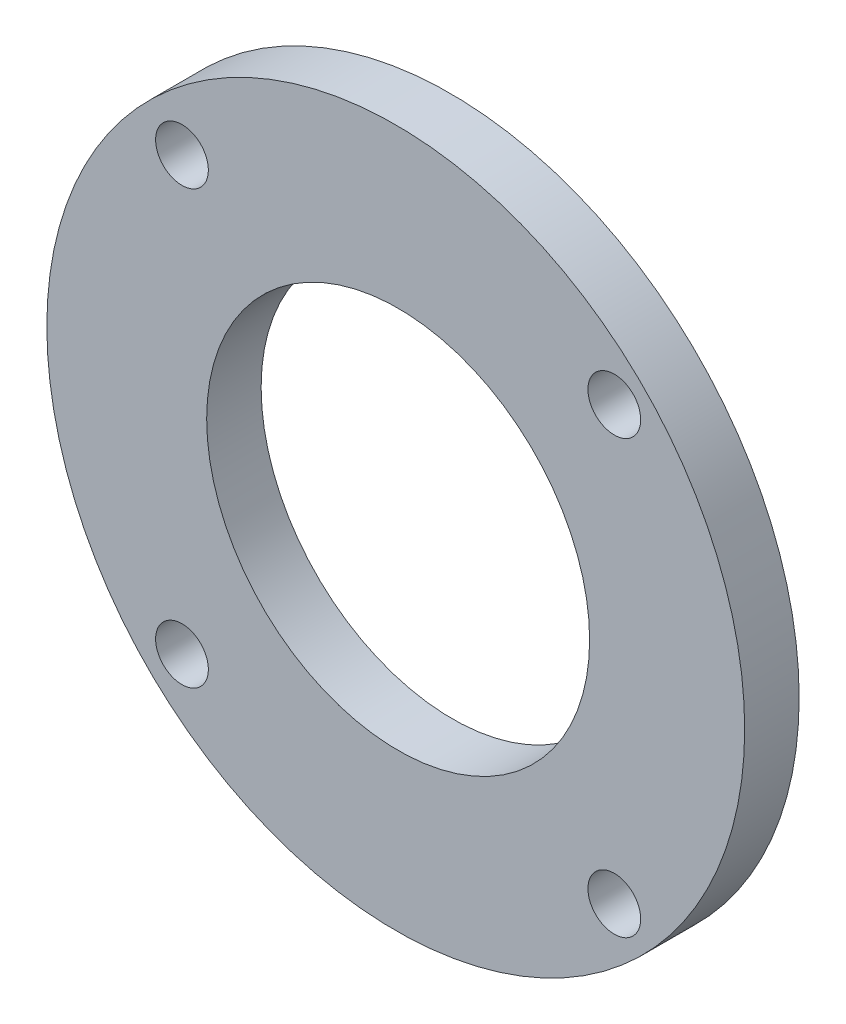
ISO-10303-21;
HEADER;
FILE_DESCRIPTION(('STEP AP214'),'2;1');
FILE_NAME('part.step','',(''),(''),'','','');
FILE_SCHEMA(('AUTOMOTIVE_DESIGN { 1 0 10303 214 1 1 1 1 }'));
ENDSEC;
DATA;
#1=APPLICATION_CONTEXT('core data for automotive mechanical design processes');
#2=APPLICATION_PROTOCOL_DEFINITION('international standard','automotive_design',2000,#1);
#3=PRODUCT_CONTEXT('',#1,'mechanical');
#4=PRODUCT('Part','Part','',(#3));
#5=PRODUCT_RELATED_PRODUCT_CATEGORY('part','',(#4));
#6=PRODUCT_DEFINITION_FORMATION('','',#4);
#7=PRODUCT_DEFINITION_CONTEXT('part definition',#1,'design');
#8=PRODUCT_DEFINITION('design','',#6,#7);
#9=PRODUCT_DEFINITION_SHAPE('','',#8);
#10=(LENGTH_UNIT() NAMED_UNIT(*) SI_UNIT(.MILLI.,.METRE.));
#11=(NAMED_UNIT(*) PLANE_ANGLE_UNIT() SI_UNIT($,.RADIAN.));
#12=(NAMED_UNIT(*) SI_UNIT($,.STERADIAN.) SOLID_ANGLE_UNIT());
#13=UNCERTAINTY_MEASURE_WITH_UNIT(LENGTH_MEASURE(1.E-05),#10,'distance_accuracy_value','');
#14=(GEOMETRIC_REPRESENTATION_CONTEXT(3) GLOBAL_UNCERTAINTY_ASSIGNED_CONTEXT((#13)) GLOBAL_UNIT_ASSIGNED_CONTEXT((#10,
#11,#12)) REPRESENTATION_CONTEXT('',''));
#15=CARTESIAN_POINT('',(0.,0.,0.));
#16=DIRECTION('',(0.,0.,1.));
#17=DIRECTION('',(1.,0.,0.));
#18=AXIS2_PLACEMENT_3D('',#15,#16,#17);
#19=CARTESIAN_POINT('',(22.0851636370484,22.238164350057,3.2));
#20=DIRECTION('',(0.,0.,-1.));
#21=DIRECTION('',(-1.,0.,0.));
#22=AXIS2_PLACEMENT_3D('',#19,#20,#21);
#23=CYLINDRICAL_SURFACE('',#22,20.5);
#24=CARTESIAN_POINT('',(22.0851636370484,22.238164350057,3.2));
#25=DIRECTION('',(0.,0.,1.));
#26=DIRECTION('',(1.,0.,0.));
#27=AXIS2_PLACEMENT_3D('',#24,#25,#26);
#28=CIRCLE('',#27,20.5);
#29=CARTESIAN_POINT('',(42.5851636370484,22.238164350057,3.2));
#30=VERTEX_POINT('',#29);
#31=EDGE_CURVE('E10',#30,#30,#28,.T.);
#32=ORIENTED_EDGE('',*,*,#31,.F.);
#33=EDGE_LOOP('',(#32));
#34=FACE_BOUND('',#33,.T.);
#35=CARTESIAN_POINT('',(22.0851636370484,22.238164350057,0.));
#36=DIRECTION('',(0.,0.,1.));
#37=DIRECTION('',(1.,0.,0.));
#38=AXIS2_PLACEMENT_3D('',#35,#36,#37);
#39=CIRCLE('',#38,20.5);
#40=CARTESIAN_POINT('',(42.5851636370484,22.238164350057,0.));
#41=VERTEX_POINT('',#40);
#42=EDGE_CURVE('E33',#41,#41,#39,.T.);
#43=ORIENTED_EDGE('',*,*,#42,.T.);
#44=EDGE_LOOP('',(#43));
#45=FACE_BOUND('',#44,.T.);
#46=ADVANCED_FACE('F27',(#34,#45),#23,.T.);
#47=CARTESIAN_POINT('',(22.0851636370484,22.238164350057,3.2));
#48=DIRECTION('',(0.,0.,1.));
#49=DIRECTION('',(1.,0.,0.));
#50=AXIS2_PLACEMENT_3D('',#47,#48,#49);
#51=PLANE('',#50);
#52=CARTESIAN_POINT('',(9.525,9.525,3.2));
#53=DIRECTION('',(0.,0.,1.));
#54=DIRECTION('',(1.,0.,0.));
#55=AXIS2_PLACEMENT_3D('',#52,#53,#54);
#56=CIRCLE('',#55,1.55);
#57=CARTESIAN_POINT('',(11.075,9.525,3.2));
#58=VERTEX_POINT('',#57);
#59=EDGE_CURVE('E67',#58,#58,#56,.T.);
#60=ORIENTED_EDGE('',*,*,#59,.F.);
#61=EDGE_LOOP('',(#60));
#62=FACE_BOUND('',#61,.T.);
#63=CARTESIAN_POINT('',(34.925,9.525,3.2));
#64=DIRECTION('',(0.,0.,1.));
#65=DIRECTION('',(1.,0.,0.));
#66=AXIS2_PLACEMENT_3D('',#63,#64,#65);
#67=CIRCLE('',#66,1.55);
#68=CARTESIAN_POINT('',(36.475,9.525,3.2));
#69=VERTEX_POINT('',#68);
#70=EDGE_CURVE('E61',#69,#69,#67,.T.);
#71=ORIENTED_EDGE('',*,*,#70,.F.);
#72=EDGE_LOOP('',(#71));
#73=FACE_BOUND('',#72,.T.);
#74=CARTESIAN_POINT('',(9.525,34.925,3.2));
#75=DIRECTION('',(0.,0.,1.));
#76=DIRECTION('',(1.,0.,0.));
#77=AXIS2_PLACEMENT_3D('',#74,#75,#76);
#78=CIRCLE('',#77,1.55);
#79=CARTESIAN_POINT('',(11.075,34.925,3.2));
#80=VERTEX_POINT('',#79);
#81=EDGE_CURVE('E55',#80,#80,#78,.T.);
#82=ORIENTED_EDGE('',*,*,#81,.F.);
#83=EDGE_LOOP('',(#82));
#84=FACE_BOUND('',#83,.T.);
#85=CARTESIAN_POINT('',(34.925,34.925,3.2));
#86=DIRECTION('',(0.,0.,1.));
#87=DIRECTION('',(1.,0.,0.));
#88=AXIS2_PLACEMENT_3D('',#85,#86,#87);
#89=CIRCLE('',#88,1.55);
#90=CARTESIAN_POINT('',(36.475,34.925,3.2));
#91=VERTEX_POINT('',#90);
#92=EDGE_CURVE('E49',#91,#91,#89,.T.);
#93=ORIENTED_EDGE('',*,*,#92,.F.);
#94=EDGE_LOOP('',(#93));
#95=FACE_BOUND('',#94,.T.);
#96=CARTESIAN_POINT('',(22.225,22.225,3.2));
#97=DIRECTION('',(0.,0.,1.));
#98=DIRECTION('',(1.,0.,0.));
#99=AXIS2_PLACEMENT_3D('',#96,#97,#98);
#100=CIRCLE('',#99,11.25);
#101=CARTESIAN_POINT('',(33.475,22.225,3.2));
#102=VERTEX_POINT('',#101);
#103=EDGE_CURVE('E41',#102,#102,#100,.T.);
#104=ORIENTED_EDGE('',*,*,#103,.F.);
#105=EDGE_LOOP('',(#104));
#106=FACE_BOUND('',#105,.T.);
#107=ORIENTED_EDGE('',*,*,#31,.T.);
#108=EDGE_LOOP('',(#107));
#109=FACE_BOUND('',#108,.T.);
#110=ADVANCED_FACE('F73',(#62,#73,#84,#95,#106,#109),#51,.T.);
#111=CARTESIAN_POINT('',(22.0851636370484,22.238164350057,0.));
#112=DIRECTION('',(0.,0.,1.));
#113=DIRECTION('',(1.,0.,0.));
#114=AXIS2_PLACEMENT_3D('',#111,#112,#113);
#115=PLANE('',#114);
#116=CARTESIAN_POINT('',(9.525,9.525,0.));
#117=DIRECTION('',(0.,0.,1.));
#118=DIRECTION('',(1.,0.,0.));
#119=AXIS2_PLACEMENT_3D('',#116,#117,#118);
#120=CIRCLE('',#119,1.55);
#121=CARTESIAN_POINT('',(11.075,9.525,0.));
#122=VERTEX_POINT('',#121);
#123=EDGE_CURVE('E64',#122,#122,#120,.T.);
#124=ORIENTED_EDGE('',*,*,#123,.T.);
#125=EDGE_LOOP('',(#124));
#126=FACE_BOUND('',#125,.T.);
#127=CARTESIAN_POINT('',(34.925,9.525,0.));
#128=DIRECTION('',(0.,0.,1.));
#129=DIRECTION('',(1.,0.,0.));
#130=AXIS2_PLACEMENT_3D('',#127,#128,#129);
#131=CIRCLE('',#130,1.55);
#132=CARTESIAN_POINT('',(36.475,9.525,0.));
#133=VERTEX_POINT('',#132);
#134=EDGE_CURVE('E58',#133,#133,#131,.T.);
#135=ORIENTED_EDGE('',*,*,#134,.T.);
#136=EDGE_LOOP('',(#135));
#137=FACE_BOUND('',#136,.T.);
#138=CARTESIAN_POINT('',(9.525,34.925,0.));
#139=DIRECTION('',(0.,0.,1.));
#140=DIRECTION('',(1.,0.,0.));
#141=AXIS2_PLACEMENT_3D('',#138,#139,#140);
#142=CIRCLE('',#141,1.55);
#143=CARTESIAN_POINT('',(11.075,34.925,0.));
#144=VERTEX_POINT('',#143);
#145=EDGE_CURVE('E52',#144,#144,#142,.T.);
#146=ORIENTED_EDGE('',*,*,#145,.T.);
#147=EDGE_LOOP('',(#146));
#148=FACE_BOUND('',#147,.T.);
#149=CARTESIAN_POINT('',(34.925,34.925,0.));
#150=DIRECTION('',(0.,0.,1.));
#151=DIRECTION('',(1.,0.,0.));
#152=AXIS2_PLACEMENT_3D('',#149,#150,#151);
#153=CIRCLE('',#152,1.55);
#154=CARTESIAN_POINT('',(36.475,34.925,0.));
#155=VERTEX_POINT('',#154);
#156=EDGE_CURVE('E46',#155,#155,#153,.T.);
#157=ORIENTED_EDGE('',*,*,#156,.T.);
#158=EDGE_LOOP('',(#157));
#159=FACE_BOUND('',#158,.T.);
#160=CARTESIAN_POINT('',(22.225,22.225,0.));
#161=DIRECTION('',(0.,0.,1.));
#162=DIRECTION('',(1.,0.,0.));
#163=AXIS2_PLACEMENT_3D('',#160,#161,#162);
#164=CIRCLE('',#163,11.25);
#165=CARTESIAN_POINT('',(33.475,22.225,0.));
#166=VERTEX_POINT('',#165);
#167=EDGE_CURVE('E37',#166,#166,#164,.T.);
#168=ORIENTED_EDGE('',*,*,#167,.T.);
#169=EDGE_LOOP('',(#168));
#170=FACE_BOUND('',#169,.T.);
#171=ORIENTED_EDGE('',*,*,#42,.F.);
#172=EDGE_LOOP('',(#171));
#173=FACE_BOUND('',#172,.T.);
#174=ADVANCED_FACE('F76',(#126,#137,#148,#159,#170,#173),#115,.F.);
#175=CARTESIAN_POINT('',(22.225,22.225,0.));
#176=DIRECTION('',(0.,0.,1.));
#177=DIRECTION('',(1.,0.,0.));
#178=AXIS2_PLACEMENT_3D('',#175,#176,#177);
#179=CYLINDRICAL_SURFACE('',#178,11.25);
#180=ORIENTED_EDGE('',*,*,#167,.F.);
#181=EDGE_LOOP('',(#180));
#182=FACE_BOUND('',#181,.T.);
#183=ORIENTED_EDGE('',*,*,#103,.T.);
#184=EDGE_LOOP('',(#183));
#185=FACE_BOUND('',#184,.T.);
#186=ADVANCED_FACE('F85',(#182,#185),#179,.F.);
#187=CARTESIAN_POINT('',(34.925,34.925,0.));
#188=DIRECTION('',(0.,0.,1.));
#189=DIRECTION('',(1.,0.,0.));
#190=AXIS2_PLACEMENT_3D('',#187,#188,#189);
#191=CYLINDRICAL_SURFACE('',#190,1.55);
#192=ORIENTED_EDGE('',*,*,#156,.F.);
#193=EDGE_LOOP('',(#192));
#194=FACE_BOUND('',#193,.T.);
#195=ORIENTED_EDGE('',*,*,#92,.T.);
#196=EDGE_LOOP('',(#195));
#197=FACE_BOUND('',#196,.T.);
#198=ADVANCED_FACE('F87',(#194,#197),#191,.F.);
#199=CARTESIAN_POINT('',(9.525,34.925,0.));
#200=DIRECTION('',(0.,0.,1.));
#201=DIRECTION('',(1.,0.,0.));
#202=AXIS2_PLACEMENT_3D('',#199,#200,#201);
#203=CYLINDRICAL_SURFACE('',#202,1.55);
#204=ORIENTED_EDGE('',*,*,#145,.F.);
#205=EDGE_LOOP('',(#204));
#206=FACE_BOUND('',#205,.T.);
#207=ORIENTED_EDGE('',*,*,#81,.T.);
#208=EDGE_LOOP('',(#207));
#209=FACE_BOUND('',#208,.T.);
#210=ADVANCED_FACE('F94',(#206,#209),#203,.F.);
#211=CARTESIAN_POINT('',(34.925,9.525,0.));
#212=DIRECTION('',(0.,0.,1.));
#213=DIRECTION('',(1.,0.,0.));
#214=AXIS2_PLACEMENT_3D('',#211,#212,#213);
#215=CYLINDRICAL_SURFACE('',#214,1.55);
#216=ORIENTED_EDGE('',*,*,#134,.F.);
#217=EDGE_LOOP('',(#216));
#218=FACE_BOUND('',#217,.T.);
#219=ORIENTED_EDGE('',*,*,#70,.T.);
#220=EDGE_LOOP('',(#219));
#221=FACE_BOUND('',#220,.T.);
#222=ADVANCED_FACE('F128',(#218,#221),#215,.F.);
#223=CARTESIAN_POINT('',(9.525,9.525,0.));
#224=DIRECTION('',(0.,0.,1.));
#225=DIRECTION('',(1.,0.,0.));
#226=AXIS2_PLACEMENT_3D('',#223,#224,#225);
#227=CYLINDRICAL_SURFACE('',#226,1.55);
#228=ORIENTED_EDGE('',*,*,#123,.F.);
#229=EDGE_LOOP('',(#228));
#230=FACE_BOUND('',#229,.T.);
#231=ORIENTED_EDGE('',*,*,#59,.T.);
#232=EDGE_LOOP('',(#231));
#233=FACE_BOUND('',#232,.T.);
#234=ADVANCED_FACE('F71',(#230,#233),#227,.F.);
#235=CLOSED_SHELL('',(#46,#110,#174,#186,#198,#210,#222,#234));
#236=MANIFOLD_SOLID_BREP('B2',#235);
#237=ADVANCED_BREP_SHAPE_REPRESENTATION('',(#18,#236),#14);
#238=SHAPE_DEFINITION_REPRESENTATION(#9,#237);
ENDSEC;
END-ISO-10303-21;
